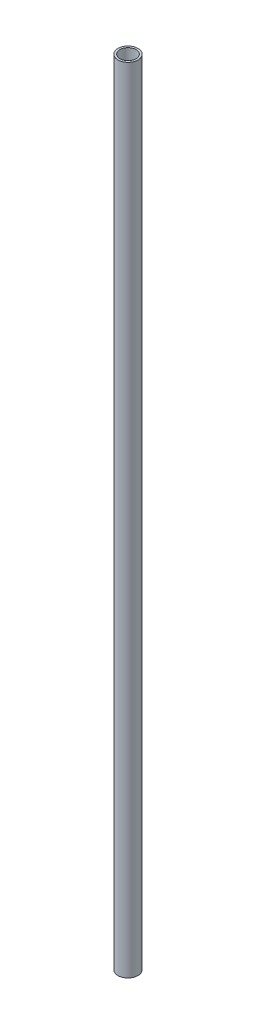
ISO-10303-21;
HEADER;
FILE_DESCRIPTION(('STEP AP214'),'2;1');
FILE_NAME('part.step','',(''),(''),'','','');
FILE_SCHEMA(('AUTOMOTIVE_DESIGN { 1 0 10303 214 1 1 1 1 }'));
ENDSEC;
DATA;
#1=APPLICATION_CONTEXT('core data for automotive mechanical design processes');
#2=APPLICATION_PROTOCOL_DEFINITION('international standard','automotive_design',2000,#1);
#3=PRODUCT_CONTEXT('',#1,'mechanical');
#4=PRODUCT('Part','Part','',(#3));
#5=PRODUCT_RELATED_PRODUCT_CATEGORY('part','',(#4));
#6=PRODUCT_DEFINITION_FORMATION('','',#4);
#7=PRODUCT_DEFINITION_CONTEXT('part definition',#1,'design');
#8=PRODUCT_DEFINITION('design','',#6,#7);
#9=PRODUCT_DEFINITION_SHAPE('','',#8);
#10=(LENGTH_UNIT() NAMED_UNIT(*) SI_UNIT(.MILLI.,.METRE.));
#11=(NAMED_UNIT(*) PLANE_ANGLE_UNIT() SI_UNIT($,.RADIAN.));
#12=(NAMED_UNIT(*) SI_UNIT($,.STERADIAN.) SOLID_ANGLE_UNIT());
#13=UNCERTAINTY_MEASURE_WITH_UNIT(LENGTH_MEASURE(1.E-05),#10,'distance_accuracy_value','');
#14=(GEOMETRIC_REPRESENTATION_CONTEXT(3) GLOBAL_UNCERTAINTY_ASSIGNED_CONTEXT((#13)) GLOBAL_UNIT_ASSIGNED_CONTEXT((#10,
#11,#12)) REPRESENTATION_CONTEXT('',''));
#15=CARTESIAN_POINT('',(0.,0.,0.));
#16=DIRECTION('',(0.,0.,1.));
#17=DIRECTION('',(1.,0.,0.));
#18=AXIS2_PLACEMENT_3D('',#15,#16,#17);
#19=CARTESIAN_POINT('',(0.,791.6,0.));
#20=DIRECTION('',(0.,1.,0.));
#21=DIRECTION('',(0.,0.,1.));
#22=AXIS2_PLACEMENT_3D('',#19,#20,#21);
#23=PLANE('',#22);
#24=CARTESIAN_POINT('',(0.,791.6,0.));
#25=DIRECTION('',(0.,1.,0.));
#26=DIRECTION('',(0.,0.,1.));
#27=AXIS2_PLACEMENT_3D('',#24,#25,#26);
#28=CIRCLE('',#27,10.);
#29=CARTESIAN_POINT('',(0.,791.6,10.));
#30=VERTEX_POINT('',#29);
#31=EDGE_CURVE('E10',#30,#30,#28,.T.);
#32=ORIENTED_EDGE('',*,*,#31,.T.);
#33=EDGE_LOOP('',(#32));
#34=FACE_BOUND('',#33,.T.);
#35=CARTESIAN_POINT('',(0.,791.6,0.));
#36=DIRECTION('',(0.,1.,0.));
#37=DIRECTION('',(0.,0.,1.));
#38=AXIS2_PLACEMENT_3D('',#35,#36,#37);
#39=CIRCLE('',#38,8.);
#40=CARTESIAN_POINT('',(0.,791.6,8.));
#41=VERTEX_POINT('',#40);
#42=EDGE_CURVE('E44',#41,#41,#39,.T.);
#43=ORIENTED_EDGE('',*,*,#42,.F.);
#44=EDGE_LOOP('',(#43));
#45=FACE_BOUND('',#44,.T.);
#46=ADVANCED_FACE('F33',(#34,#45),#23,.T.);
#47=CARTESIAN_POINT('',(0.,0.,0.));
#48=DIRECTION('',(0.,1.,0.));
#49=DIRECTION('',(0.,0.,1.));
#50=AXIS2_PLACEMENT_3D('',#47,#48,#49);
#51=PLANE('',#50);
#52=CARTESIAN_POINT('',(0.,0.,0.));
#53=DIRECTION('',(0.,1.,0.));
#54=DIRECTION('',(0.,0.,1.));
#55=AXIS2_PLACEMENT_3D('',#52,#53,#54);
#56=CIRCLE('',#55,10.);
#57=CARTESIAN_POINT('',(0.,0.,10.));
#58=VERTEX_POINT('',#57);
#59=EDGE_CURVE('E37',#58,#58,#56,.T.);
#60=ORIENTED_EDGE('',*,*,#59,.F.);
#61=EDGE_LOOP('',(#60));
#62=FACE_BOUND('',#61,.T.);
#63=CARTESIAN_POINT('',(0.,0.,0.));
#64=DIRECTION('',(0.,1.,0.));
#65=DIRECTION('',(0.,0.,1.));
#66=AXIS2_PLACEMENT_3D('',#63,#64,#65);
#67=CIRCLE('',#66,8.);
#68=CARTESIAN_POINT('',(0.,0.,8.));
#69=VERTEX_POINT('',#68);
#70=EDGE_CURVE('E46',#69,#69,#67,.T.);
#71=ORIENTED_EDGE('',*,*,#70,.T.);
#72=EDGE_LOOP('',(#71));
#73=FACE_BOUND('',#72,.T.);
#74=ADVANCED_FACE('F56',(#62,#73),#51,.F.);
#75=CARTESIAN_POINT('',(0.,791.6,0.));
#76=DIRECTION('',(0.,-1.,0.));
#77=DIRECTION('',(0.,0.,-1.));
#78=AXIS2_PLACEMENT_3D('',#75,#76,#77);
#79=CYLINDRICAL_SURFACE('',#78,10.);
#80=ORIENTED_EDGE('',*,*,#31,.F.);
#81=EDGE_LOOP('',(#80));
#82=FACE_BOUND('',#81,.T.);
#83=ORIENTED_EDGE('',*,*,#59,.T.);
#84=EDGE_LOOP('',(#83));
#85=FACE_BOUND('',#84,.T.);
#86=ADVANCED_FACE('F35',(#82,#85),#79,.T.);
#87=CARTESIAN_POINT('',(0.,791.6,0.));
#88=DIRECTION('',(0.,-1.,0.));
#89=DIRECTION('',(0.,0.,-1.));
#90=AXIS2_PLACEMENT_3D('',#87,#88,#89);
#91=CYLINDRICAL_SURFACE('',#90,8.);
#92=ORIENTED_EDGE('',*,*,#42,.T.);
#93=EDGE_LOOP('',(#92));
#94=FACE_BOUND('',#93,.T.);
#95=ORIENTED_EDGE('',*,*,#70,.F.);
#96=EDGE_LOOP('',(#95));
#97=FACE_BOUND('',#96,.T.);
#98=ADVANCED_FACE('F52',(#94,#97),#91,.F.);
#99=CLOSED_SHELL('',(#46,#74,#86,#98));
#100=MANIFOLD_SOLID_BREP('B2',#99);
#101=ADVANCED_BREP_SHAPE_REPRESENTATION('',(#18,#100),#14);
#102=SHAPE_DEFINITION_REPRESENTATION(#9,#101);
ENDSEC;
END-ISO-10303-21;
